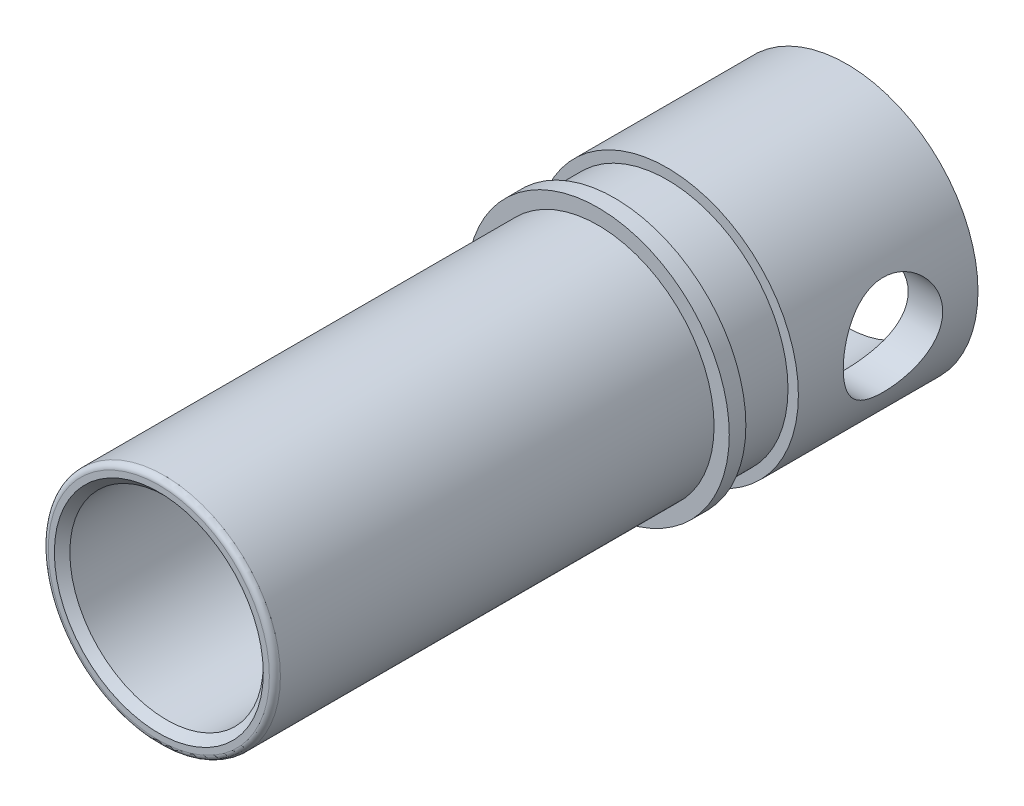
ISO-10303-21;
HEADER;
FILE_DESCRIPTION(('STEP AP214'),'2;1');
FILE_NAME('part.step','',(''),(''),'','','');
FILE_SCHEMA(('AUTOMOTIVE_DESIGN { 1 0 10303 214 1 1 1 1 }'));
ENDSEC;
DATA;
#1=APPLICATION_CONTEXT('core data for automotive mechanical design processes');
#2=APPLICATION_PROTOCOL_DEFINITION('international standard','automotive_design',2000,#1);
#3=PRODUCT_CONTEXT('',#1,'mechanical');
#4=PRODUCT('Part','Part','',(#3));
#5=PRODUCT_RELATED_PRODUCT_CATEGORY('part','',(#4));
#6=PRODUCT_DEFINITION_FORMATION('','',#4);
#7=PRODUCT_DEFINITION_CONTEXT('part definition',#1,'design');
#8=PRODUCT_DEFINITION('design','',#6,#7);
#9=PRODUCT_DEFINITION_SHAPE('','',#8);
#10=(LENGTH_UNIT() NAMED_UNIT(*) SI_UNIT(.MILLI.,.METRE.));
#11=(NAMED_UNIT(*) PLANE_ANGLE_UNIT() SI_UNIT($,.RADIAN.));
#12=(NAMED_UNIT(*) SI_UNIT($,.STERADIAN.) SOLID_ANGLE_UNIT());
#13=UNCERTAINTY_MEASURE_WITH_UNIT(LENGTH_MEASURE(1.E-05),#10,'distance_accuracy_value','');
#14=(GEOMETRIC_REPRESENTATION_CONTEXT(3) GLOBAL_UNCERTAINTY_ASSIGNED_CONTEXT((#13)) GLOBAL_UNIT_ASSIGNED_CONTEXT((#10,
#11,#12)) REPRESENTATION_CONTEXT('',''));
#15=CARTESIAN_POINT('',(0.,0.,0.));
#16=DIRECTION('',(0.,0.,1.));
#17=DIRECTION('',(1.,0.,0.));
#18=AXIS2_PLACEMENT_3D('',#15,#16,#17);
#19=CARTESIAN_POINT('',(0.,0.,3.05));
#20=DIRECTION('',(0.,0.,-1.));
#21=DIRECTION('',(-1.,0.,0.));
#22=AXIS2_PLACEMENT_3D('',#19,#20,#21);
#23=PLANE('',#22);
#24=CARTESIAN_POINT('',(0.,12.25,3.05));
#25=DIRECTION('',(0.,0.,-1.));
#26=DIRECTION('',(-1.,0.,0.));
#27=AXIS2_PLACEMENT_3D('',#24,#25,#26);
#28=CIRCLE('',#27,1.75);
#29=CARTESIAN_POINT('',(-1.75,12.25,3.05));
#30=VERTEX_POINT('',#29);
#31=EDGE_CURVE('E123',#30,#30,#28,.T.);
#32=ORIENTED_EDGE('',*,*,#31,.T.);
#33=EDGE_LOOP('',(#32));
#34=FACE_BOUND('',#33,.T.);
#35=ADVANCED_FACE('F16',(#34),#23,.T.);
#36=CARTESIAN_POINT('',(0.,12.25,-1.26));
#37=DIRECTION('',(0.,0.,-1.));
#38=DIRECTION('',(-1.,0.,0.));
#39=AXIS2_PLACEMENT_3D('',#36,#37,#38);
#40=CYLINDRICAL_SURFACE('',#39,1.75);
#41=CARTESIAN_POINT('',(1.50083310198036,13.15,0.451949111339007));
#42=CARTESIAN_POINT('',(1.50083488272567,13.149998693007,0.498685245003958));
#43=CARTESIAN_POINT('',(1.50304668819304,13.1463394487437,0.545431842245589));
#44=CARTESIAN_POINT('',(1.51155581746705,13.131910175589,0.637443585592967));
#45=CARTESIAN_POINT('',(1.51785675410198,13.1211338584741,0.682707384431758));
#46=CARTESIAN_POINT('',(1.53362036970765,13.0930678214738,0.770292500859312));
#47=CARTESIAN_POINT('',(1.54306686853779,13.0758113771984,0.812627564196114));
#48=CARTESIAN_POINT('',(1.56403046823373,13.0353826337787,0.893800321757676));
#49=CARTESIAN_POINT('',(1.57554819787372,13.0122085372825,0.932636948555511));
#50=CARTESIAN_POINT('',(1.60058360370385,12.9582311011991,1.00944367911577));
#51=CARTESIAN_POINT('',(1.61418809405723,12.9269379890688,1.04704138924727));
#52=CARTESIAN_POINT('',(1.6411661589285,12.8586236355624,1.11675020607523));
#53=CARTESIAN_POINT('',(1.6545395924804,12.8215990257154,1.14885806281358));
#54=CARTESIAN_POINT('',(1.68070758479698,12.7395960942239,1.2089581132464));
#55=CARTESIAN_POINT('',(1.69338951827769,12.6942353677098,1.23648189113545));
#56=CARTESIAN_POINT('',(1.71559031497765,12.5987693774918,1.28331963801583));
#57=CARTESIAN_POINT('',(1.72511329305835,12.5486703961028,1.30264429643056));
#58=CARTESIAN_POINT('',(1.73816914047865,12.4571106438662,1.32877676911263));
#59=CARTESIAN_POINT('',(1.74257399761463,12.4162958720463,1.33743674260277));
#60=CARTESIAN_POINT('',(1.74848941830367,12.3336565782129,1.34902249546196));
#61=CARTESIAN_POINT('',(1.75000090377252,12.2918323821351,1.35195010134366));
#62=CARTESIAN_POINT('',(1.74999898020588,12.2027973947566,1.35194799424272));
#63=CARTESIAN_POINT('',(1.74807234157539,12.1555843667823,1.34821810200799));
#64=CARTESIAN_POINT('',(1.74056343980446,12.0625993990024,1.33348202568693));
#65=CARTESIAN_POINT('',(1.7349790759198,12.0168283031856,1.32247166016599));
#66=CARTESIAN_POINT('',(1.72073503761087,11.9281582044151,1.29372327775478));
#67=CARTESIAN_POINT('',(1.71208607912451,11.8852498049907,1.27600868894316));
#68=CARTESIAN_POINT('',(1.69249587222953,11.8030718488845,1.23449410961358));
#69=CARTESIAN_POINT('',(1.6815541853819,11.7638029902677,1.21069295496799));
#70=CARTESIAN_POINT('',(1.65756777631255,11.6872592124783,1.15598951481023));
#71=CARTESIAN_POINT('',(1.64443415986435,11.650264153598,1.12473528234239));
#72=CARTESIAN_POINT('',(1.61781687801268,11.5817775765691,1.05677079479514));
#73=CARTESIAN_POINT('',(1.60433291875059,11.5502908618581,1.0200558288997));
#74=CARTESIAN_POINT('',(1.57723757573516,11.4910741640786,0.938546306065512));
#75=CARTESIAN_POINT('',(1.56370977522137,11.4638782907602,0.893332897412496));
#76=CARTESIAN_POINT('',(1.53958139358361,11.4176088386775,0.798230300467739));
#77=CARTESIAN_POINT('',(1.52897655750773,11.3985234313495,0.74834805192016));
#78=CARTESIAN_POINT('',(1.51431984660204,11.3727884550628,0.657339836553825));
#79=CARTESIAN_POINT('',(1.50931592204018,11.3642754048415,0.616890177764345));
#80=CARTESIAN_POINT('',(1.50257270351838,11.3528822266134,0.534945720979582));
#81=CARTESIAN_POINT('',(1.50083152065019,11.3499988393694,0.493451541802471));
#82=CARTESIAN_POINT('',(1.50083488272567,11.350001306993,0.405212977674057));
#83=CARTESIAN_POINT('',(1.50304668819304,11.3536605512563,0.358466380432425));
#84=CARTESIAN_POINT('',(1.51155581746705,11.368089824411,0.266454637085047));
#85=CARTESIAN_POINT('',(1.51785675410198,11.3788661415259,0.221190838246256));
#86=CARTESIAN_POINT('',(1.53362036970765,11.4069321785262,0.133605721818702));
#87=CARTESIAN_POINT('',(1.54306686853779,11.4241886228016,0.0912706584818996));
#88=CARTESIAN_POINT('',(1.56403046823373,11.4646173662213,0.0100979009203373));
#89=CARTESIAN_POINT('',(1.57554819787372,11.4877914627175,-0.0287387258774978));
#90=CARTESIAN_POINT('',(1.60058360370385,11.5417688988009,-0.105545456437757));
#91=CARTESIAN_POINT('',(1.61418809405723,11.5730620109312,-0.143143166569252));
#92=CARTESIAN_POINT('',(1.6411661589285,11.6413763644376,-0.212851983397211));
#93=CARTESIAN_POINT('',(1.6545395924804,11.6784009742846,-0.244959840135564));
#94=CARTESIAN_POINT('',(1.68070758479698,11.7604039057761,-0.305059890568387));
#95=CARTESIAN_POINT('',(1.69338951827769,11.8057646322902,-0.332583668457432));
#96=CARTESIAN_POINT('',(1.71559031497765,11.9012306225082,-0.379421415337812));
#97=CARTESIAN_POINT('',(1.72511329305835,11.9513296038972,-0.398746073752541));
#98=CARTESIAN_POINT('',(1.73816914047865,12.0428893561338,-0.424878546434612));
#99=CARTESIAN_POINT('',(1.74257399761463,12.0837041279537,-0.433538519924756));
#100=CARTESIAN_POINT('',(1.74848941830367,12.1663434217871,-0.445124272783946));
#101=CARTESIAN_POINT('',(1.75000090377252,12.2081676178649,-0.448051878665642));
#102=CARTESIAN_POINT('',(1.74999898020588,12.2972026052434,-0.44804977156471));
#103=CARTESIAN_POINT('',(1.74807234157539,12.3444156332177,-0.44431987932998));
#104=CARTESIAN_POINT('',(1.74056343980446,12.4374006009976,-0.429583803008912));
#105=CARTESIAN_POINT('',(1.7349790759198,12.4831716968144,-0.418573437487976));
#106=CARTESIAN_POINT('',(1.72073503761087,12.5718417955849,-0.38982505507677));
#107=CARTESIAN_POINT('',(1.71208607912451,12.6147501950093,-0.372110466265144));
#108=CARTESIAN_POINT('',(1.69249587222953,12.6969281511155,-0.330595886935562));
#109=CARTESIAN_POINT('',(1.6815541853819,12.7361970097323,-0.306794732289971));
#110=CARTESIAN_POINT('',(1.65756777631255,12.8127407875217,-0.252091292132214));
#111=CARTESIAN_POINT('',(1.64443415986435,12.849735846402,-0.220837059664379));
#112=CARTESIAN_POINT('',(1.61781687801268,12.9182224234309,-0.152872572117126));
#113=CARTESIAN_POINT('',(1.60433291875059,12.9497091381419,-0.116157606221683));
#114=CARTESIAN_POINT('',(1.57723757573516,13.0089258359214,-0.0346480833874987));
#115=CARTESIAN_POINT('',(1.56370977522137,13.0361217092398,0.0105653252655178));
#116=CARTESIAN_POINT('',(1.53958139358361,13.0823911613225,0.105667922210275));
#117=CARTESIAN_POINT('',(1.52897655750773,13.1014765686505,0.155550170757855));
#118=CARTESIAN_POINT('',(1.51431984660204,13.1272115449372,0.246558386124189));
#119=CARTESIAN_POINT('',(1.50931592204018,13.1357245951585,0.28700804491367));
#120=CARTESIAN_POINT('',(1.50257270351838,13.1471177733866,0.368952501698432));
#121=CARTESIAN_POINT('',(1.50083152065019,13.1500011606306,0.410446680875544));
#122=CARTESIAN_POINT('',(1.50083310198036,13.15,0.451949111339007));
#123=B_SPLINE_CURVE_WITH_KNOTS('',3,(#41,#42,#43,#44,#45,#46,#47,#48,#49,#50,#51,#52,#53,#54,
#55,#56,#57,#58,#59,#60,#61,#62,#63,#64,#65,#66,#67,#68,#69,#70,#71,#72,#73,#74,#75,#76,#77,#78,
#79,#80,#81,#82,#83,#84,#85,#86,#87,#88,#89,#90,#91,#92,#93,#94,#95,#96,#97,#98,#99,#100,#101,
#102,#103,#104,#105,#106,#107,#108,#109,#110,#111,#112,#113,#114,#115,#116,#117,#118,#119,#120,
#121,#122),.UNSPECIFIED.,.T.,.F.,(4,2,2,2,2,2,2,2,2,2,2,2,2,2,2,2,2,2,2,2,2,2,2,2,2,2,2,2,2,2,2,
2,2,2,2,2,2,2,2,2,4),(0.,0.140040739115821,0.280205375751845,0.419659892953219,
0.559156816767793,0.710845696032673,0.862624065546963,1.02542821566668,1.18801945631339,
1.31341246171476,1.43876550645407,1.58021072149747,1.72173724419833,1.86277369837549,
2.00383714764236,2.15375471254678,2.30380236526896,2.46639379543062,2.62874727637787,
2.75317774051329,2.87753614548689,3.01757688460271,3.15774152123873,3.29719603844011,
3.43669296225468,3.58838184151956,3.74016021103385,3.90296436115357,4.06555560180028,
4.19094860720165,4.31630165194096,4.45774686698436,4.59927338968522,4.74030984386238,
4.88137329312925,5.03129085803367,5.18133851075585,5.34392994091751,5.50628342186476,
5.63071388600018,5.75507229097378),.UNSPECIFIED.);
#124=CARTESIAN_POINT('',(1.50083310198036,13.15,0.451949111339007));
#125=VERTEX_POINT('',#124);
#126=EDGE_CURVE('E119',#125,#125,#123,.T.);
#127=ORIENTED_EDGE('',*,*,#126,.T.);
#128=EDGE_LOOP('',(#127));
#129=FACE_BOUND('',#128,.T.);
#130=CARTESIAN_POINT('',(0.,12.25,-1.08610177732199));
#131=DIRECTION('',(0.,0.,-1.));
#132=DIRECTION('',(-1.,0.,0.));
#133=AXIS2_PLACEMENT_3D('',#130,#131,#132);
#134=CIRCLE('',#133,1.75);
#135=CARTESIAN_POINT('',(-1.75,12.25,-1.08610177732199));
#136=VERTEX_POINT('',#135);
#137=EDGE_CURVE('E109',#136,#136,#134,.F.);
#138=ORIENTED_EDGE('',*,*,#137,.F.);
#139=EDGE_LOOP('',(#138));
#140=FACE_BOUND('',#139,.T.);
#141=ORIENTED_EDGE('',*,*,#31,.F.);
#142=EDGE_LOOP('',(#141));
#143=FACE_BOUND('',#142,.T.);
#144=ADVANCED_FACE('F115',(#129,#140,#143),#40,.F.);
#145=CARTESIAN_POINT('',(0.,12.25,0.451949111339007));
#146=DIRECTION('',(1.,0.,0.));
#147=DIRECTION('',(0.,0.,-1.));
#148=AXIS2_PLACEMENT_3D('',#145,#146,#147);
#149=CYLINDRICAL_SURFACE('',#148,0.9);
#150=CARTESIAN_POINT('',(2.375,12.25,-0.448050888660993));
#151=CARTESIAN_POINT('',(2.3749984795776,12.2013391290903,-0.44804894485342));
#152=CARTESIAN_POINT('',(2.37348955919515,12.1526567107565,-0.444087899673943));
#153=CARTESIAN_POINT('',(2.36761130316949,12.0567187510865,-0.428397108722499));
#154=CARTESIAN_POINT('',(2.36323967267138,12.0094643863516,-0.416661130186554));
#155=CARTESIAN_POINT('',(2.35210800749596,11.9178260353736,-0.38590006662634));
#156=CARTESIAN_POINT('',(2.34535358067677,11.8734355966294,-0.366892087296783));
#157=CARTESIAN_POINT('',(2.33012781234027,11.7884869940124,-0.32220255134184));
#158=CARTESIAN_POINT('',(2.32165632180956,11.7479291631964,-0.296520415452819));
#159=CARTESIAN_POINT('',(2.30345929207839,11.6700320324976,-0.238051208442983));
#160=CARTESIAN_POINT('',(2.29369774313747,11.6328798037784,-0.205026219321886));
#161=CARTESIAN_POINT('',(2.27419420485044,11.5644831956063,-0.133306150772626));
#162=CARTESIAN_POINT('',(2.26445222739562,11.5332417124356,-0.0946083080276887));
#163=CARTESIAN_POINT('',(2.24566774093994,11.476349166675,-0.0107924685289438));
#164=CARTESIAN_POINT('',(2.23666797347588,11.4509671907897,0.0345185457359979));
#165=CARTESIAN_POINT('',(2.22096145717471,11.4082891225863,0.129136357745053));
#166=CARTESIAN_POINT('',(2.21425174393602,11.3909825661548,0.178437886774833));
#167=CARTESIAN_POINT('',(2.20548527434867,11.3687754711098,0.265272349073916));
#168=CARTESIAN_POINT('',(2.20264958224555,11.3617515486767,0.302196226724833));
#169=CARTESIAN_POINT('',(2.19884044197844,11.3523633576096,0.376725481219626));
#170=CARTESIAN_POINT('',(2.1978667242078,11.349998414372,0.414330758603334));
#171=CARTESIAN_POINT('',(2.19787029901936,11.3500020451192,0.500468697568616));
#172=CARTESIAN_POINT('',(2.19949473336649,11.3539409181809,0.549010035238371));
#173=CARTESIAN_POINT('',(2.20578213547849,11.3695355939309,0.64465413440949));
#174=CARTESIAN_POINT('',(2.21044776480495,11.3811981563009,0.691755597940239));
#175=CARTESIAN_POINT('',(2.22221022151569,11.4117449636917,0.783068910476816));
#176=CARTESIAN_POINT('',(2.22930019346178,11.4306088624492,0.827288493420815));
#177=CARTESIAN_POINT('',(2.24510284344058,11.474957864305,0.911943517400839));
#178=CARTESIAN_POINT('',(2.2538157358467,11.5004438422972,0.952378457457684));
#179=CARTESIAN_POINT('',(2.27237880139204,11.5587005996185,1.03038030858791));
#180=CARTESIAN_POINT('',(2.28226291328788,11.5917534425468,1.06772853925331));
#181=CARTESIAN_POINT('',(2.30177379376686,11.663615098878,1.13651291993656));
#182=CARTESIAN_POINT('',(2.31140046055085,11.7024261506093,1.1679467600893));
#183=CARTESIAN_POINT('',(2.32971775696357,11.7863746731943,1.22507176523114));
#184=CARTESIAN_POINT('',(2.33836349034561,11.8316867898975,1.25052174209992));
#185=CARTESIAN_POINT('',(2.35332410946359,11.9263108569777,1.29332541975597));
#186=CARTESIAN_POINT('',(2.35964183060601,11.9756178518562,1.31068897626227));
#187=CARTESIAN_POINT('',(2.36787854457283,12.0625944894266,1.33302604204293));
#188=CARTESIAN_POINT('',(2.37053334371841,12.0996666636554,1.34010582614867));
#189=CARTESIAN_POINT('',(2.37409456705135,12.1744882821452,1.34956786158312));
#190=CARTESIAN_POINT('',(2.375001179895,12.2122376528825,1.35195061979405));
#191=CARTESIAN_POINT('',(2.3749984795776,12.2986608709097,1.35194716753143));
#192=CARTESIAN_POINT('',(2.37348955919515,12.3473432892435,1.34798612235196));
#193=CARTESIAN_POINT('',(2.36761130316949,12.4432812489135,1.33229533140051));
#194=CARTESIAN_POINT('',(2.36323967267138,12.4905356136484,1.32055935286457));
#195=CARTESIAN_POINT('',(2.35210800749596,12.5821739646264,1.28979828930435));
#196=CARTESIAN_POINT('',(2.34535358067677,12.6265644033706,1.2707903099748));
#197=CARTESIAN_POINT('',(2.33012781234027,12.7115130059876,1.22610077401985));
#198=CARTESIAN_POINT('',(2.32165632180956,12.7520708368036,1.20041863813083));
#199=CARTESIAN_POINT('',(2.30345929207839,12.8299679675024,1.141949431121));
#200=CARTESIAN_POINT('',(2.29369774313747,12.8671201962216,1.1089244419999));
#201=CARTESIAN_POINT('',(2.27419420485044,12.9355168043937,1.03720437345064));
#202=CARTESIAN_POINT('',(2.26445222739562,12.9667582875644,0.998506530705703));
#203=CARTESIAN_POINT('',(2.24566774093994,13.023650833325,0.914690691206958));
#204=CARTESIAN_POINT('',(2.23666797347588,13.0490328092103,0.869379676942016));
#205=CARTESIAN_POINT('',(2.22096145717471,13.0917108774137,0.77476186493296));
#206=CARTESIAN_POINT('',(2.21425174393602,13.1090174338452,0.725460335903181));
#207=CARTESIAN_POINT('',(2.20548527434867,13.1312245288902,0.638625873604098));
#208=CARTESIAN_POINT('',(2.20264958224555,13.1382484513233,0.601701995953181));
#209=CARTESIAN_POINT('',(2.19884044197844,13.1476366423904,0.527172741458388));
#210=CARTESIAN_POINT('',(2.1978667242078,13.150001585628,0.48956746407468));
#211=CARTESIAN_POINT('',(2.19787029901936,13.1499979548808,0.403429525109398));
#212=CARTESIAN_POINT('',(2.19949473336649,13.1460590818191,0.354888187439644));
#213=CARTESIAN_POINT('',(2.20578213547849,13.1304644060691,0.259244088268525));
#214=CARTESIAN_POINT('',(2.21044776480495,13.1188018436991,0.212142624737776));
#215=CARTESIAN_POINT('',(2.22221022151569,13.0882550363083,0.120829312201198));
#216=CARTESIAN_POINT('',(2.22930019346178,13.0693911375508,0.0766097292571984));
#217=CARTESIAN_POINT('',(2.24510284344058,13.025042135695,-0.00804529472282515));
#218=CARTESIAN_POINT('',(2.2538157358467,12.9995561577029,-0.0484802347796705));
#219=CARTESIAN_POINT('',(2.27237880139204,12.9412994003815,-0.126482085909893));
#220=CARTESIAN_POINT('',(2.28226291328788,12.9082465574532,-0.163830316575299));
#221=CARTESIAN_POINT('',(2.30177379376686,12.836384901122,-0.232614697258545));
#222=CARTESIAN_POINT('',(2.31140046055085,12.7975738493907,-0.264048537411284));
#223=CARTESIAN_POINT('',(2.32971775696357,12.7136253268057,-0.321173542553122));
#224=CARTESIAN_POINT('',(2.33836349034561,12.6683132101025,-0.346623519421904));
#225=CARTESIAN_POINT('',(2.35332410946359,12.5736891430223,-0.389427197077961));
#226=CARTESIAN_POINT('',(2.35964183060601,12.5243821481438,-0.406790753584261));
#227=CARTESIAN_POINT('',(2.36787854457283,12.4374055105734,-0.429127819364917));
#228=CARTESIAN_POINT('',(2.37053334371841,12.4003333363446,-0.436207603470655));
#229=CARTESIAN_POINT('',(2.37409456705135,12.3255117178548,-0.445669638905109));
#230=CARTESIAN_POINT('',(2.375001179895,12.2877623471175,-0.44805239711604));
#231=CARTESIAN_POINT('',(2.375,12.25,-0.448050888660993));
#232=B_SPLINE_CURVE_WITH_KNOTS('',3,(#150,#151,#152,#153,#154,#155,#156,#157,#158,#159,#160,
#161,#162,#163,#164,#165,#166,#167,#168,#169,#170,#171,#172,#173,#174,#175,#176,#177,#178,#179,
#180,#181,#182,#183,#184,#185,#186,#187,#188,#189,#190,#191,#192,#193,#194,#195,#196,#197,#198,
#199,#200,#201,#202,#203,#204,#205,#206,#207,#208,#209,#210,#211,#212,#213,#214,#215,#216,#217,
#218,#219,#220,#221,#222,#223,#224,#225,#226,#227,#228,#229,#230,#231),.UNSPECIFIED.,.T.,.F.,(4,
2,2,2,2,2,2,2,2,2,2,2,2,2,2,2,2,2,2,2,2,2,2,2,2,2,2,2,2,2,2,2,2,2,2,2,2,2,2,2,4),(0.,
0.145839690447043,0.291796434769159,0.437411939933915,0.583040087588119,0.734344537896958,
0.885722936888034,1.04307177445039,1.20021614955423,1.31297589733816,1.42571931671229,
1.57113408531158,1.71667628768159,1.86181029046772,2.00696347778197,2.15881991807011,
2.31073554333962,2.46800047310751,2.62507322368865,2.73826156836487,2.85143769758778,
2.99727738803483,3.14323413235694,3.2888496375217,3.4344777851759,3.58578223548474,
3.73716063447582,3.89450947203817,4.05165384714201,4.16441359492595,4.27715701430008,
4.42257178289937,4.56811398526937,4.71324798805551,4.85840117536975,5.01025761565789,
5.1621732409274,5.31943817069529,5.47651092127644,5.58969926595265,5.70287539517557),.UNSPECIFIED.);
#233=CARTESIAN_POINT('',(2.375,12.25,-0.448050888660993));
#234=VERTEX_POINT('',#233);
#235=EDGE_CURVE('E102',#234,#234,#232,.T.);
#236=ORIENTED_EDGE('',*,*,#235,.F.);
#237=EDGE_LOOP('',(#236));
#238=FACE_BOUND('',#237,.T.);
#239=ORIENTED_EDGE('',*,*,#126,.F.);
#240=EDGE_LOOP('',(#239));
#241=FACE_BOUND('',#240,.T.);
#242=ADVANCED_FACE('F112',(#238,#241),#149,.F.);
#243=CARTESIAN_POINT('',(0.,0.,-1.08610177732199));
#244=DIRECTION('',(0.,0.,-1.));
#245=DIRECTION('',(-1.,0.,0.));
#246=AXIS2_PLACEMENT_3D('',#243,#244,#245);
#247=PLANE('',#246);
#248=CARTESIAN_POINT('',(0.,12.25,-1.08610177732199));
#249=DIRECTION('',(0.,0.,1.));
#250=DIRECTION('',(1.,0.,0.));
#251=AXIS2_PLACEMENT_3D('',#248,#249,#250);
#252=CIRCLE('',#251,2.375);
#253=CARTESIAN_POINT('',(2.375,12.25,-1.08610177732199));
#254=VERTEX_POINT('',#253);
#255=EDGE_CURVE('E108',#254,#254,#252,.T.);
#256=ORIENTED_EDGE('',*,*,#255,.F.);
#257=EDGE_LOOP('',(#256));
#258=FACE_BOUND('',#257,.T.);
#259=ORIENTED_EDGE('',*,*,#137,.T.);
#260=EDGE_LOOP('',(#259));
#261=FACE_BOUND('',#260,.T.);
#262=ADVANCED_FACE('F98',(#258,#261),#247,.T.);
#263=CARTESIAN_POINT('',(0.,12.25,-1.26));
#264=DIRECTION('',(0.,0.,1.));
#265=DIRECTION('',(1.,0.,0.));
#266=AXIS2_PLACEMENT_3D('',#263,#264,#265);
#267=CYLINDRICAL_SURFACE('',#266,2.375);
#268=ORIENTED_EDGE('',*,*,#235,.T.);
#269=EDGE_LOOP('',(#268));
#270=FACE_BOUND('',#269,.T.);
#271=CARTESIAN_POINT('',(0.,12.25,2.16389822267801));
#272=DIRECTION('',(0.,0.,1.));
#273=DIRECTION('',(1.,0.,0.));
#274=AXIS2_PLACEMENT_3D('',#271,#272,#273);
#275=CIRCLE('',#274,2.375);
#276=CARTESIAN_POINT('',(2.375,12.25,2.16389822267801));
#277=VERTEX_POINT('',#276);
#278=EDGE_CURVE('E176',#277,#277,#275,.T.);
#279=ORIENTED_EDGE('',*,*,#278,.F.);
#280=EDGE_LOOP('',(#279));
#281=FACE_BOUND('',#280,.T.);
#282=ORIENTED_EDGE('',*,*,#255,.T.);
#283=EDGE_LOOP('',(#282));
#284=FACE_BOUND('',#283,.T.);
#285=ADVANCED_FACE('F93',(#270,#281,#284),#267,.T.);
#286=CARTESIAN_POINT('',(-2.48900093834244,12.4842527031444,2.16389822267801));
#287=DIRECTION('',(0.,0.,1.));
#288=DIRECTION('',(1.,0.,0.));
#289=AXIS2_PLACEMENT_3D('',#286,#287,#288);
#290=PLANE('',#289);
#291=ORIENTED_EDGE('',*,*,#278,.T.);
#292=EDGE_LOOP('',(#291));
#293=FACE_BOUND('',#292,.T.);
#294=CARTESIAN_POINT('',(0.,12.25,2.16389822267801));
#295=DIRECTION('',(0.,0.,1.));
#296=DIRECTION('',(1.,0.,0.));
#297=AXIS2_PLACEMENT_3D('',#294,#295,#296);
#298=CIRCLE('',#297,2.1875);
#299=CARTESIAN_POINT('',(2.1875,12.25,2.16389822267801));
#300=VERTEX_POINT('',#299);
#301=EDGE_CURVE('E174',#300,#300,#298,.T.);
#302=ORIENTED_EDGE('',*,*,#301,.F.);
#303=EDGE_LOOP('',(#302));
#304=FACE_BOUND('',#303,.T.);
#305=ADVANCED_FACE('F89',(#293,#304),#290,.T.);
#306=CARTESIAN_POINT('',(0.,0.,3.36));
#307=DIRECTION('',(0.,0.,-1.));
#308=DIRECTION('',(-1.,0.,0.));
#309=AXIS2_PLACEMENT_3D('',#306,#307,#308);
#310=PLANE('',#309);
#311=CARTESIAN_POINT('',(0.,12.25,3.36));
#312=DIRECTION('',(0.,0.,1.));
#313=DIRECTION('',(1.,0.,0.));
#314=AXIS2_PLACEMENT_3D('',#311,#312,#313);
#315=CIRCLE('',#314,1.75);
#316=CARTESIAN_POINT('',(1.75,12.25,3.36));
#317=VERTEX_POINT('',#316);
#318=EDGE_CURVE('E171',#317,#317,#315,.T.);
#319=ORIENTED_EDGE('',*,*,#318,.T.);
#320=EDGE_LOOP('',(#319));
#321=FACE_BOUND('',#320,.T.);
#322=ADVANCED_FACE('F85',(#321),#310,.F.);
#323=CARTESIAN_POINT('',(0.,12.25,-1.26));
#324=DIRECTION('',(0.,0.,1.));
#325=DIRECTION('',(1.,0.,0.));
#326=AXIS2_PLACEMENT_3D('',#323,#324,#325);
#327=CYLINDRICAL_SURFACE('',#326,2.1875);
#328=CARTESIAN_POINT('',(0.,12.25,3.11389822267801));
#329=DIRECTION('',(0.,0.,1.));
#330=DIRECTION('',(1.,0.,0.));
#331=AXIS2_PLACEMENT_3D('',#328,#329,#330);
#332=CIRCLE('',#331,2.1875);
#333=CARTESIAN_POINT('',(2.1875,12.25,3.11389822267801));
#334=VERTEX_POINT('',#333);
#335=EDGE_CURVE('E161',#334,#334,#332,.T.);
#336=ORIENTED_EDGE('',*,*,#335,.F.);
#337=EDGE_LOOP('',(#336));
#338=FACE_BOUND('',#337,.T.);
#339=ORIENTED_EDGE('',*,*,#301,.T.);
#340=EDGE_LOOP('',(#339));
#341=FACE_BOUND('',#340,.T.);
#342=ADVANCED_FACE('F81',(#338,#341),#327,.T.);
#343=CARTESIAN_POINT('',(0.,12.25,11.36));
#344=DIRECTION('',(0.,0.,1.));
#345=DIRECTION('',(1.,0.,0.));
#346=AXIS2_PLACEMENT_3D('',#343,#344,#345);
#347=CYLINDRICAL_SURFACE('',#346,1.75);
#348=CARTESIAN_POINT('',(0.,12.25,11.2199999999802));
#349=DIRECTION('',(0.,0.,1.));
#350=DIRECTION('',(-1.,0.,0.));
#351=AXIS2_PLACEMENT_3D('',#348,#349,#350);
#352=CIRCLE('',#351,1.75000000001546);
#353=CARTESIAN_POINT('',(-1.75000000001546,12.25,11.2199999999802));
#354=VERTEX_POINT('',#353);
#355=EDGE_CURVE('E153',#354,#354,#352,.T.);
#356=ORIENTED_EDGE('',*,*,#355,.T.);
#357=EDGE_LOOP('',(#356));
#358=FACE_BOUND('',#357,.T.);
#359=ORIENTED_EDGE('',*,*,#318,.F.);
#360=EDGE_LOOP('',(#359));
#361=FACE_BOUND('',#360,.T.);
#362=ADVANCED_FACE('F77',(#358,#361),#347,.F.);
#363=CARTESIAN_POINT('',(-2.48900093834244,12.4842527031444,3.11389822267801));
#364=DIRECTION('',(0.,0.,-1.));
#365=DIRECTION('',(-1.,0.,0.));
#366=AXIS2_PLACEMENT_3D('',#363,#364,#365);
#367=PLANE('',#366);
#368=CARTESIAN_POINT('',(0.,12.25,3.11389822267801));
#369=DIRECTION('',(0.,0.,1.));
#370=DIRECTION('',(1.,0.,0.));
#371=AXIS2_PLACEMENT_3D('',#368,#369,#370);
#372=CIRCLE('',#371,2.375);
#373=CARTESIAN_POINT('',(2.375,12.25,3.11389822267801));
#374=VERTEX_POINT('',#373);
#375=EDGE_CURVE('E41',#374,#374,#372,.T.);
#376=ORIENTED_EDGE('',*,*,#375,.F.);
#377=EDGE_LOOP('',(#376));
#378=FACE_BOUND('',#377,.T.);
#379=ORIENTED_EDGE('',*,*,#335,.T.);
#380=EDGE_LOOP('',(#379));
#381=FACE_BOUND('',#380,.T.);
#382=ADVANCED_FACE('F73',(#378,#381),#367,.T.);
#383=CARTESIAN_POINT('',(0.,12.25,11.3599999999678));
#384=DIRECTION('',(0.,0.,1.));
#385=DIRECTION('',(1.,0.,0.));
#386=AXIS2_PLACEMENT_3D('',#383,#384,#385);
#387=CONICAL_SURFACE('',#386,1.88999999994621,0.785398163397448);
#388=ORIENTED_EDGE('',*,*,#355,.F.);
#389=EDGE_LOOP('',(#388));
#390=FACE_BOUND('',#389,.T.);
#391=CARTESIAN_POINT('',(0.,12.25,11.3600000000247));
#392=DIRECTION('',(0.,0.,1.));
#393=DIRECTION('',(1.,0.,0.));
#394=AXIS2_PLACEMENT_3D('',#391,#392,#393);
#395=CIRCLE('',#394,1.89000000000306);
#396=CARTESIAN_POINT('',(1.89000000000306,12.25,11.3600000000247));
#397=VERTEX_POINT('',#396);
#398=EDGE_CURVE('E40',#397,#397,#395,.T.);
#399=ORIENTED_EDGE('',*,*,#398,.T.);
#400=EDGE_LOOP('',(#399));
#401=FACE_BOUND('',#400,.T.);
#402=ADVANCED_FACE('F69',(#390,#401),#387,.F.);
#403=CARTESIAN_POINT('',(0.,12.25,-1.26));
#404=DIRECTION('',(0.,0.,1.));
#405=DIRECTION('',(1.,0.,0.));
#406=AXIS2_PLACEMENT_3D('',#403,#404,#405);
#407=CYLINDRICAL_SURFACE('',#406,2.375);
#408=CARTESIAN_POINT('',(0.,12.25,3.41389822267801));
#409=DIRECTION('',(0.,0.,1.));
#410=DIRECTION('',(1.,0.,0.));
#411=AXIS2_PLACEMENT_3D('',#408,#409,#410);
#412=CIRCLE('',#411,2.375);
#413=CARTESIAN_POINT('',(2.375,12.25,3.41389822267801));
#414=VERTEX_POINT('',#413);
#415=EDGE_CURVE('E45',#414,#414,#412,.T.);
#416=ORIENTED_EDGE('',*,*,#415,.F.);
#417=EDGE_LOOP('',(#416));
#418=FACE_BOUND('',#417,.T.);
#419=ORIENTED_EDGE('',*,*,#375,.T.);
#420=EDGE_LOOP('',(#419));
#421=FACE_BOUND('',#420,.T.);
#422=ADVANCED_FACE('F64',(#418,#421),#407,.T.);
#423=CARTESIAN_POINT('',(0.,0.,11.36));
#424=DIRECTION('',(0.,0.,-1.));
#425=DIRECTION('',(-1.,0.,0.));
#426=AXIS2_PLACEMENT_3D('',#423,#424,#425);
#427=PLANE('',#426);
#428=ORIENTED_EDGE('',*,*,#398,.F.);
#429=EDGE_LOOP('',(#428));
#430=FACE_BOUND('',#429,.T.);
#431=CARTESIAN_POINT('',(0.,12.25,11.36));
#432=DIRECTION('',(0.,0.,-1.));
#433=DIRECTION('',(1.,0.,0.));
#434=AXIS2_PLACEMENT_3D('',#431,#432,#433);
#435=CIRCLE('',#434,2.);
#436=CARTESIAN_POINT('',(2.,12.25,11.36));
#437=VERTEX_POINT('',#436);
#438=CARTESIAN_POINT('',(-2.,12.25,11.36));
#439=VERTEX_POINT('',#438);
#440=EDGE_CURVE('E33',#437,#439,#435,.T.);
#441=ORIENTED_EDGE('',*,*,#440,.F.);
#442=CARTESIAN_POINT('',(0.,12.25,11.36));
#443=DIRECTION('',(0.,0.,-1.));
#444=DIRECTION('',(-1.,0.,0.));
#445=AXIS2_PLACEMENT_3D('',#442,#443,#444);
#446=CIRCLE('',#445,2.);
#447=EDGE_CURVE('E38',#439,#437,#446,.T.);
#448=ORIENTED_EDGE('',*,*,#447,.F.);
#449=EDGE_LOOP('',(#441,#448));
#450=FACE_BOUND('',#449,.T.);
#451=ADVANCED_FACE('F44',(#430,#450),#427,.F.);
#452=CARTESIAN_POINT('',(-1.80982832005951,10.913204783106,3.41389822267801));
#453=DIRECTION('',(0.,0.,1.));
#454=DIRECTION('',(1.,0.,0.));
#455=AXIS2_PLACEMENT_3D('',#452,#453,#454);
#456=PLANE('',#455);
#457=CARTESIAN_POINT('',(0.,12.25,3.41389822267801));
#458=DIRECTION('',(0.,0.,1.));
#459=DIRECTION('',(1.,0.,0.));
#460=AXIS2_PLACEMENT_3D('',#457,#458,#459);
#461=CIRCLE('',#460,2.1);
#462=CARTESIAN_POINT('',(2.1,12.25,3.41389822267801));
#463=VERTEX_POINT('',#462);
#464=EDGE_CURVE('E27',#463,#463,#461,.T.);
#465=ORIENTED_EDGE('',*,*,#464,.F.);
#466=EDGE_LOOP('',(#465));
#467=FACE_BOUND('',#466,.T.);
#468=ORIENTED_EDGE('',*,*,#415,.T.);
#469=EDGE_LOOP('',(#468));
#470=FACE_BOUND('',#469,.T.);
#471=ADVANCED_FACE('F63',(#467,#470),#456,.T.);
#472=CARTESIAN_POINT('',(0.,12.25,11.26));
#473=DIRECTION('',(0.,0.,-1.));
#474=DIRECTION('',(-1.,0.,0.));
#475=AXIS2_PLACEMENT_3D('',#472,#473,#474);
#476=TOROIDAL_SURFACE('',#475,2.,0.1);
#477=CARTESIAN_POINT('',(0.,12.25,11.26));
#478=DIRECTION('',(0.,0.,1.));
#479=DIRECTION('',(1.,0.,0.));
#480=AXIS2_PLACEMENT_3D('',#477,#478,#479);
#481=CIRCLE('',#480,2.1);
#482=CARTESIAN_POINT('',(2.1,12.25,11.26));
#483=VERTEX_POINT('',#482);
#484=EDGE_CURVE('E10',#483,#483,#481,.F.);
#485=ORIENTED_EDGE('',*,*,#484,.F.);
#486=EDGE_LOOP('',(#485));
#487=FACE_BOUND('',#486,.T.);
#488=ORIENTED_EDGE('',*,*,#447,.T.);
#489=ORIENTED_EDGE('',*,*,#440,.T.);
#490=EDGE_LOOP('',(#488,#489));
#491=FACE_BOUND('',#490,.T.);
#492=ADVANCED_FACE('F37',(#487,#491),#476,.T.);
#493=CARTESIAN_POINT('',(0.,12.25,-1.26));
#494=DIRECTION('',(0.,0.,1.));
#495=DIRECTION('',(1.,0.,0.));
#496=AXIS2_PLACEMENT_3D('',#493,#494,#495);
#497=CYLINDRICAL_SURFACE('',#496,2.1);
#498=ORIENTED_EDGE('',*,*,#464,.T.);
#499=EDGE_LOOP('',(#498));
#500=FACE_BOUND('',#499,.T.);
#501=ORIENTED_EDGE('',*,*,#484,.T.);
#502=EDGE_LOOP('',(#501));
#503=FACE_BOUND('',#502,.T.);
#504=ADVANCED_FACE('F136',(#500,#503),#497,.T.);
#505=CLOSED_SHELL('',(#35,#144,#242,#262,#285,#305,#322,#342,#362,#382,#402,#422,#451,#471,#492,#504));
#506=MANIFOLD_SOLID_BREP('B1',#505);
#507=ADVANCED_BREP_SHAPE_REPRESENTATION('',(#18,#506),#14);
#508=SHAPE_DEFINITION_REPRESENTATION(#9,#507);
ENDSEC;
END-ISO-10303-21;
